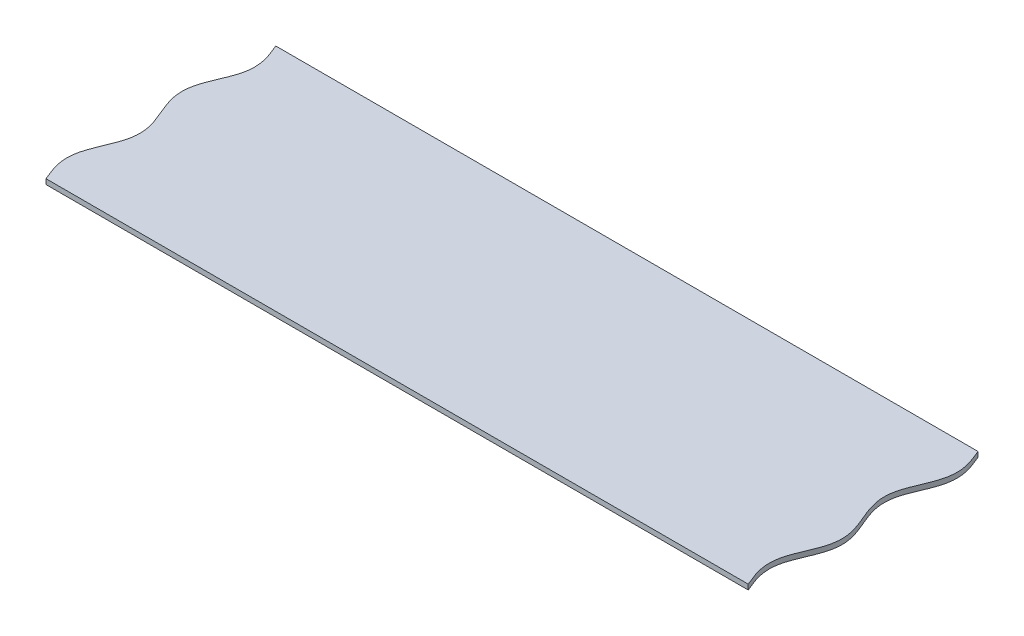
ISO-10303-21;
HEADER;
FILE_DESCRIPTION(('STEP AP214'),'2;1');
FILE_NAME('part.step','',(''),(''),'','','');
FILE_SCHEMA(('AUTOMOTIVE_DESIGN { 1 0 10303 214 1 1 1 1 }'));
ENDSEC;
DATA;
#1=APPLICATION_CONTEXT('core data for automotive mechanical design processes');
#2=APPLICATION_PROTOCOL_DEFINITION('international standard','automotive_design',2000,#1);
#3=PRODUCT_CONTEXT('',#1,'mechanical');
#4=PRODUCT('Part','Part','',(#3));
#5=PRODUCT_RELATED_PRODUCT_CATEGORY('part','',(#4));
#6=PRODUCT_DEFINITION_FORMATION('','',#4);
#7=PRODUCT_DEFINITION_CONTEXT('part definition',#1,'design');
#8=PRODUCT_DEFINITION('design','',#6,#7);
#9=PRODUCT_DEFINITION_SHAPE('','',#8);
#10=(LENGTH_UNIT() NAMED_UNIT(*) SI_UNIT(.MILLI.,.METRE.));
#11=(NAMED_UNIT(*) PLANE_ANGLE_UNIT() SI_UNIT($,.RADIAN.));
#12=(NAMED_UNIT(*) SI_UNIT($,.STERADIAN.) SOLID_ANGLE_UNIT());
#13=UNCERTAINTY_MEASURE_WITH_UNIT(LENGTH_MEASURE(1.E-05),#10,'distance_accuracy_value','');
#14=(GEOMETRIC_REPRESENTATION_CONTEXT(3) GLOBAL_UNCERTAINTY_ASSIGNED_CONTEXT((#13)) GLOBAL_UNIT_ASSIGNED_CONTEXT((#10,
#11,#12)) REPRESENTATION_CONTEXT('',''));
#15=CARTESIAN_POINT('',(0.,0.,0.));
#16=DIRECTION('',(0.,0.,1.));
#17=DIRECTION('',(1.,0.,0.));
#18=AXIS2_PLACEMENT_3D('',#15,#16,#17);
#19=CARTESIAN_POINT('',(-2.35405307341685E-08,0.4,-5.61970180202394E-08));
#20=CARTESIAN_POINT('',(0.0494495661381411,0.4,0.118048236069568));
#21=CARTESIAN_POINT('',(0.111116121184017,0.4,0.265261766996543));
#22=CARTESIAN_POINT('',(0.230875712673065,0.4,0.55805511117052));
#23=CARTESIAN_POINT('',(0.313966247908023,0.4,0.786539770390726));
#24=CARTESIAN_POINT('',(0.362563048289926,0.4,0.927516596163399));
#25=CARTESIAN_POINT('',(0.424573497522529,0.4,1.12026697634937));
#26=CARTESIAN_POINT('',(0.492346833762047,0.4,1.36157607631107));
#27=CARTESIAN_POINT('',(0.55444187721002,0.4,1.64969832437487));
#28=CARTESIAN_POINT('',(0.59227490752003,0.4,1.94940671354727));
#29=CARTESIAN_POINT('',(0.603031319326619,0.4,2.20689908536188));
#30=CARTESIAN_POINT('',(0.596617784063861,0.4,2.46474336959455));
#31=CARTESIAN_POINT('',(0.573067652303098,0.4,2.72166970040472));
#32=CARTESIAN_POINT('',(0.514178040831651,0.4,3.06399896610735));
#33=CARTESIAN_POINT('',(0.399297622639695,0.4,3.48531298984352));
#34=CARTESIAN_POINT('',(0.250895239755528,0.4,3.89566574624263));
#35=CARTESIAN_POINT('',(0.0855364014202337,0.4,4.29915457779215));
#36=CARTESIAN_POINT('',(-0.0995903555496819,0.4,4.73744639665663));
#37=CARTESIAN_POINT('',(-0.296840695920366,0.4,5.22071892240837));
#38=CARTESIAN_POINT('',(-0.493648556000378,0.4,5.79695302279281));
#39=CARTESIAN_POINT('',(-0.61897346333208,0.4,6.48344913641748));
#40=CARTESIAN_POINT('',(-0.599627971633935,0.4,7.23206646503726));
#41=CARTESIAN_POINT('',(-0.381223590951468,0.4,8.12012400416252));
#42=CARTESIAN_POINT('',(-5.5685825114775E-05,0.4,9.00003028030908));
#43=CARTESIAN_POINT('',(0.381336688080292,0.4,9.87980857089514));
#44=CARTESIAN_POINT('',(0.600500416456521,0.4,10.7676510708526));
#45=CARTESIAN_POINT('',(0.620704458219472,0.4,11.516242150026));
#46=CARTESIAN_POINT('',(0.496048404377023,0.4,12.2028761607043));
#47=CARTESIAN_POINT('',(0.299570119251832,0.4,12.7792334867136));
#48=CARTESIAN_POINT('',(0.102439221558699,0.4,13.2625534127887));
#49=CARTESIAN_POINT('',(-0.0826850468522331,0.4,13.7008510557735));
#50=CARTESIAN_POINT('',(-0.248137810946988,0.4,14.104290103407));
#51=CARTESIAN_POINT('',(-0.396725969096224,0.4,14.5145927201949));
#52=CARTESIAN_POINT('',(-0.511937811817736,0.4,14.9357809783447));
#53=CARTESIAN_POINT('',(-0.57846201816067,0.4,15.3204935820909));
#54=CARTESIAN_POINT('',(-0.604879230090261,0.4,15.6636268757174));
#55=CARTESIAN_POINT('',(-0.596327840453271,0.4,16.0079949296469));
#56=CARTESIAN_POINT('',(-0.55402238058021,0.4,16.3491642860312));
#57=CARTESIAN_POINT('',(-0.483044582191102,0.4,16.6773748268579));
#58=CARTESIAN_POINT('',(-0.392947327461695,0.4,16.9880511698901));
#59=CARTESIAN_POINT('',(-0.286122000299486,0.4,17.2934184343235));
#60=CARTESIAN_POINT('',(-0.184743293074093,0.4,17.5560837715398));
#61=CARTESIAN_POINT('',(-0.0740935836441976,0.4,17.8230984616433));
#62=CARTESIAN_POINT('',(-0.0247247362519877,0.4,17.9409758279026));
#63=CARTESIAN_POINT('',(0.,0.4,17.9999999999999));
#64=B_SPLINE_CURVE_WITH_KNOTS('',4,(#19,#20,#21,#22,#23,#24,#25,#26,#27,#28,#29,#30,#31,#32,#33,
#34,#35,#36,#37,#38,#39,#40,#41,#42,#43,#44,#45,#46,#47,#48,#49,#50,#51,#52,#53,#54,#55,#56,#57,
#58,#59,#60,#61,#62,#63),.UNSPECIFIED.,.F.,.F.,(5,1,1,1,1,1,1,1,1,1,1,1,1,1,1,1,1,1,1,1,1,1,1,1,
1,1,1,1,1,1,1,1,1,1,1,1,1,1,1,1,1,5),(0.0833223804585912,0.110604579934175,0.117425130614809,
0.124245681295442,0.131066231976076,0.13788678265671,0.153149397742294,0.168412012827879,
0.183674668985074,0.191305997063671,0.198937325142268,0.214200036492889,0.229462747843509,
0.25292917999729,0.276395612151072,0.291658349723026,0.30692108729498,0.337446562438887,
0.369116697537713,0.399642007072217,0.430167332794017,0.469468853942264,0.530519820110093,
0.569821340830344,0.600346668093855,0.63087197738376,0.662542111398898,0.69306758670517,
0.708330324358306,0.723593062011442,0.747059493053706,0.770525924095969,0.785788636660392,
0.801051349224814,0.816314004528948,0.831576659833081,0.84683927529585,0.86210189075862,
0.875742992399586,0.889384094040553,0.90302519568152,0.916666297322487),.UNSPECIFIED.);
#65=DIRECTION('',(0.,-1.,0.));
#66=VECTOR('',#65,1.);
#67=SURFACE_OF_LINEAR_EXTRUSION('',#64,#66);
#68=CARTESIAN_POINT('',(-2.35405307341685E-08,0.,-5.61970180202394E-08));
#69=CARTESIAN_POINT('',(0.0494495661381411,0.,0.118048236069568));
#70=CARTESIAN_POINT('',(0.111116121184017,0.,0.265261766996543));
#71=CARTESIAN_POINT('',(0.230875712673065,0.,0.55805511117052));
#72=CARTESIAN_POINT('',(0.313966247908023,0.,0.786539770390726));
#73=CARTESIAN_POINT('',(0.362563048289926,0.,0.927516596163399));
#74=CARTESIAN_POINT('',(0.424573497522529,0.,1.12026697634937));
#75=CARTESIAN_POINT('',(0.492346833762047,0.,1.36157607631107));
#76=CARTESIAN_POINT('',(0.55444187721002,0.,1.64969832437487));
#77=CARTESIAN_POINT('',(0.59227490752003,0.,1.94940671354727));
#78=CARTESIAN_POINT('',(0.603031319326619,0.,2.20689908536188));
#79=CARTESIAN_POINT('',(0.596617784063861,0.,2.46474336959455));
#80=CARTESIAN_POINT('',(0.573067652303098,0.,2.72166970040472));
#81=CARTESIAN_POINT('',(0.514178040831651,0.,3.06399896610735));
#82=CARTESIAN_POINT('',(0.399297622639695,0.,3.48531298984352));
#83=CARTESIAN_POINT('',(0.250895239755528,0.,3.89566574624263));
#84=CARTESIAN_POINT('',(0.0855364014202337,0.,4.29915457779215));
#85=CARTESIAN_POINT('',(-0.0995903555496819,0.,4.73744639665663));
#86=CARTESIAN_POINT('',(-0.296840695920366,0.,5.22071892240837));
#87=CARTESIAN_POINT('',(-0.493648556000378,0.,5.79695302279281));
#88=CARTESIAN_POINT('',(-0.61897346333208,0.,6.48344913641748));
#89=CARTESIAN_POINT('',(-0.599627971633935,0.,7.23206646503726));
#90=CARTESIAN_POINT('',(-0.381223590951468,0.,8.12012400416252));
#91=CARTESIAN_POINT('',(-5.5685825114775E-05,0.,9.00003028030908));
#92=CARTESIAN_POINT('',(0.381336688080292,0.,9.87980857089514));
#93=CARTESIAN_POINT('',(0.600500416456521,0.,10.7676510708526));
#94=CARTESIAN_POINT('',(0.620704458219472,0.,11.516242150026));
#95=CARTESIAN_POINT('',(0.496048404377023,0.,12.2028761607043));
#96=CARTESIAN_POINT('',(0.299570119251832,0.,12.7792334867136));
#97=CARTESIAN_POINT('',(0.102439221558699,0.,13.2625534127887));
#98=CARTESIAN_POINT('',(-0.0826850468522331,0.,13.7008510557735));
#99=CARTESIAN_POINT('',(-0.248137810946988,0.,14.104290103407));
#100=CARTESIAN_POINT('',(-0.396725969096224,0.,14.5145927201949));
#101=CARTESIAN_POINT('',(-0.511937811817736,0.,14.9357809783447));
#102=CARTESIAN_POINT('',(-0.57846201816067,0.,15.3204935820909));
#103=CARTESIAN_POINT('',(-0.604879230090261,0.,15.6636268757174));
#104=CARTESIAN_POINT('',(-0.596327840453271,0.,16.0079949296469));
#105=CARTESIAN_POINT('',(-0.55402238058021,0.,16.3491642860312));
#106=CARTESIAN_POINT('',(-0.483044582191102,0.,16.6773748268579));
#107=CARTESIAN_POINT('',(-0.392947327461695,0.,16.9880511698901));
#108=CARTESIAN_POINT('',(-0.286122000299486,0.,17.2934184343235));
#109=CARTESIAN_POINT('',(-0.184743293074093,0.,17.5560837715398));
#110=CARTESIAN_POINT('',(-0.0740935836441976,0.,17.8230984616433));
#111=CARTESIAN_POINT('',(-0.0247247362519877,0.,17.9409758279026));
#112=CARTESIAN_POINT('',(0.,0.,17.9999999999999));
#113=B_SPLINE_CURVE_WITH_KNOTS('',4,(#68,#69,#70,#71,#72,#73,#74,#75,#76,#77,#78,#79,#80,#81,
#82,#83,#84,#85,#86,#87,#88,#89,#90,#91,#92,#93,#94,#95,#96,#97,#98,#99,#100,#101,#102,#103,
#104,#105,#106,#107,#108,#109,#110,#111,#112),.UNSPECIFIED.,.F.,.F.,(5,1,1,1,1,1,1,1,1,1,1,1,1,
1,1,1,1,1,1,1,1,1,1,1,1,1,1,1,1,1,1,1,1,1,1,1,1,1,1,1,1,5),(0.0833223804585912,
0.110604579934175,0.117425130614809,0.124245681295442,0.131066231976076,0.13788678265671,
0.153149397742294,0.168412012827879,0.183674668985074,0.191305997063671,0.198937325142268,
0.214200036492889,0.229462747843509,0.25292917999729,0.276395612151072,0.291658349723026,
0.30692108729498,0.337446562438887,0.369116697537713,0.399642007072217,0.430167332794017,
0.469468853942264,0.530519820110093,0.569821340830344,0.600346668093855,0.63087197738376,
0.662542111398898,0.69306758670517,0.708330324358306,0.723593062011442,0.747059493053706,
0.770525924095969,0.785788636660392,0.801051349224814,0.816314004528948,0.831576659833081,
0.84683927529585,0.86210189075862,0.875742992399586,0.889384094040553,0.90302519568152,
0.916666297322487),.UNSPECIFIED.);
#114=CARTESIAN_POINT('',(0.,0.,0.));
#115=VERTEX_POINT('',#114);
#116=CARTESIAN_POINT('',(0.,0.,18.));
#117=VERTEX_POINT('',#116);
#118=EDGE_CURVE('E122',#115,#117,#113,.T.);
#119=ORIENTED_EDGE('',*,*,#118,.T.);
#120=DIRECTION('',(0.,-1.,0.));
#121=VECTOR('',#120,1.);
#122=CARTESIAN_POINT('',(0.,0.4,18.));
#123=LINE('',#122,#121);
#124=CARTESIAN_POINT('',(0.,0.4,18.));
#125=VERTEX_POINT('',#124);
#126=EDGE_CURVE('E11',#125,#117,#123,.T.);
#127=ORIENTED_EDGE('',*,*,#126,.F.);
#128=CARTESIAN_POINT('',(0.,0.4,0.));
#129=VERTEX_POINT('',#128);
#130=EDGE_CURVE('E91',#129,#125,#64,.T.);
#131=ORIENTED_EDGE('',*,*,#130,.F.);
#132=DIRECTION('',(0.,-1.,0.));
#133=VECTOR('',#132,1.);
#134=CARTESIAN_POINT('',(0.,0.4,0.));
#135=LINE('',#134,#133);
#136=EDGE_CURVE('E99',#129,#115,#135,.T.);
#137=ORIENTED_EDGE('',*,*,#136,.T.);
#138=EDGE_LOOP('',(#119,#127,#131,#137));
#139=FACE_BOUND('',#138,.T.);
#140=ADVANCED_FACE('F39',(#139),#67,.F.);
#141=CARTESIAN_POINT('',(55.,0.4,18.));
#142=DIRECTION('',(0.,0.,-1.));
#143=DIRECTION('',(-1.,0.,0.));
#144=AXIS2_PLACEMENT_3D('',#141,#142,#143);
#145=PLANE('',#144);
#146=DIRECTION('',(1.,0.,0.));
#147=VECTOR('',#146,1.);
#148=CARTESIAN_POINT('',(55.,0.,18.));
#149=LINE('',#148,#147);
#150=CARTESIAN_POINT('',(55.,0.,17.9999999999999));
#151=VERTEX_POINT('',#150);
#152=EDGE_CURVE('E95',#117,#151,#149,.T.);
#153=ORIENTED_EDGE('',*,*,#152,.T.);
#154=DIRECTION('',(0.,-1.,0.));
#155=VECTOR('',#154,1.);
#156=CARTESIAN_POINT('',(55.,0.4,17.9999999999999));
#157=LINE('',#156,#155);
#158=CARTESIAN_POINT('',(55.,0.4,17.9999999999999));
#159=VERTEX_POINT('',#158);
#160=EDGE_CURVE('E48',#159,#151,#157,.T.);
#161=ORIENTED_EDGE('',*,*,#160,.F.);
#162=DIRECTION('',(1.,0.,0.));
#163=VECTOR('',#162,1.);
#164=CARTESIAN_POINT('',(55.,0.4,18.));
#165=LINE('',#164,#163);
#166=EDGE_CURVE('E86',#125,#159,#165,.T.);
#167=ORIENTED_EDGE('',*,*,#166,.F.);
#168=ORIENTED_EDGE('',*,*,#126,.T.);
#169=EDGE_LOOP('',(#153,#161,#167,#168));
#170=FACE_BOUND('',#169,.T.);
#171=ADVANCED_FACE('F94',(#170),#145,.F.);
#172=CARTESIAN_POINT('',(55.,0.4,17.9999999999999));
#173=CARTESIAN_POINT('',(54.975275263748,0.4,17.9409758279025));
#174=CARTESIAN_POINT('',(54.9259064163558,0.4,17.8230984616432));
#175=CARTESIAN_POINT('',(54.8152567069258,0.4,17.5560837715396));
#176=CARTESIAN_POINT('',(54.7138779997004,0.4,17.2934184343232));
#177=CARTESIAN_POINT('',(54.6070526725382,0.4,16.9880511698898));
#178=CARTESIAN_POINT('',(54.5169554178088,0.4,16.6773748268576));
#179=CARTESIAN_POINT('',(54.4459776194196,0.4,16.3491642860308));
#180=CARTESIAN_POINT('',(54.4036721595466,0.4,16.0079949296466));
#181=CARTESIAN_POINT('',(54.3951207699096,0.4,15.6636268757171));
#182=CARTESIAN_POINT('',(54.4215379818392,0.4,15.3204935820906));
#183=CARTESIAN_POINT('',(54.4880621881821,0.4,14.9357809783444));
#184=CARTESIAN_POINT('',(54.6032740309036,0.4,14.5145927201945));
#185=CARTESIAN_POINT('',(54.7518621890529,0.4,14.1042901034067));
#186=CARTESIAN_POINT('',(54.9173149531476,0.4,13.7008510557731));
#187=CARTESIAN_POINT('',(55.1024392215585,0.4,13.2625534127883));
#188=CARTESIAN_POINT('',(55.2995701192517,0.4,12.7792334867133));
#189=CARTESIAN_POINT('',(55.4960484043769,0.4,12.202876160704));
#190=CARTESIAN_POINT('',(55.6207044582193,0.4,11.5162421500257));
#191=CARTESIAN_POINT('',(55.6005004164564,0.4,10.7676510708523));
#192=CARTESIAN_POINT('',(55.3813366880802,0.4,9.87980857089479));
#193=CARTESIAN_POINT('',(54.9999443141747,0.4,9.00003028030873));
#194=CARTESIAN_POINT('',(54.6187764090484,0.4,8.12012400416217));
#195=CARTESIAN_POINT('',(54.4003720283659,0.4,7.23206646503692));
#196=CARTESIAN_POINT('',(54.3810265366678,0.4,6.48344913641714));
#197=CARTESIAN_POINT('',(54.5063514439995,0.4,5.79695302279247));
#198=CARTESIAN_POINT('',(54.7031593040795,0.4,5.22071892240803));
#199=CARTESIAN_POINT('',(54.9004096444502,0.4,4.73744639665629));
#200=CARTESIAN_POINT('',(55.0855364014201,0.4,4.29915457779181));
#201=CARTESIAN_POINT('',(55.2508952397554,0.4,3.89566574624229));
#202=CARTESIAN_POINT('',(55.3992976226396,0.4,3.48531298984318));
#203=CARTESIAN_POINT('',(55.5141780408315,0.4,3.06399896610701));
#204=CARTESIAN_POINT('',(55.573067652303,0.4,2.72166970040438));
#205=CARTESIAN_POINT('',(55.5966177840637,0.4,2.4647433695942));
#206=CARTESIAN_POINT('',(55.6030313193265,0.4,2.20689908536154));
#207=CARTESIAN_POINT('',(55.5922749075199,0.4,1.94940671354693));
#208=CARTESIAN_POINT('',(55.5544418772099,0.4,1.64969832437453));
#209=CARTESIAN_POINT('',(55.4923468337619,0.4,1.36157607631072));
#210=CARTESIAN_POINT('',(55.4245734975224,0.4,1.12026697634903));
#211=CARTESIAN_POINT('',(55.3625630482898,0.4,0.927516596163056));
#212=CARTESIAN_POINT('',(55.3139662479079,0.4,0.786539770390383));
#213=CARTESIAN_POINT('',(55.2308757126729,0.4,0.558055111170177));
#214=CARTESIAN_POINT('',(55.1111161211839,0.4,0.2652617669962));
#215=CARTESIAN_POINT('',(55.049449566138,0.4,0.118048236069224));
#216=CARTESIAN_POINT('',(54.9999999764593,0.4,-5.61973613531861E-08));
#217=B_SPLINE_CURVE_WITH_KNOTS('',4,(#172,#173,#174,#175,#176,#177,#178,#179,#180,#181,#182,
#183,#184,#185,#186,#187,#188,#189,#190,#191,#192,#193,#194,#195,#196,#197,#198,#199,#200,#201,
#202,#203,#204,#205,#206,#207,#208,#209,#210,#211,#212,#213,#214,#215,#216),.UNSPECIFIED.,.F.,
.F.,(5,1,1,1,1,1,1,1,1,1,1,1,1,1,1,1,1,1,1,1,1,1,1,1,1,1,1,1,1,1,1,1,1,1,1,1,1,1,1,1,1,5),
(0.0833223804586111,0.096963482099578,0.110604583740545,0.124245685381512,0.137886787022479,
0.153149402485248,0.168412017948017,0.183674673252151,0.198937328556284,0.214200041120706,
0.229462753685129,0.252929184727393,0.276395615769656,0.291658353422792,0.306921091075928,
0.3374465663822,0.369116700397338,0.399642009687243,0.430167336950754,0.469468857671005,
0.530519823838834,0.569821344987081,0.600346670708881,0.630871980243385,0.662542115342211,
0.693067590486119,0.708330328058072,0.723593065630026,0.747059497783808,0.770525929937589,
0.78578864128821,0.80105135263883,0.808682680717427,0.816314008796025,0.831576664953219,
0.846839280038804,0.862101895124388,0.868922445805022,0.875742996485656,0.88256354716629,
0.889384097846923,0.916666297322487),.UNSPECIFIED.);
#218=DIRECTION('',(0.,-1.,0.));
#219=VECTOR('',#218,1.);
#220=SURFACE_OF_LINEAR_EXTRUSION('',#217,#219);
#221=CARTESIAN_POINT('',(55.,0.,17.9999999999999));
#222=CARTESIAN_POINT('',(54.975275263748,0.,17.9409758279025));
#223=CARTESIAN_POINT('',(54.9259064163558,0.,17.8230984616432));
#224=CARTESIAN_POINT('',(54.8152567069258,0.,17.5560837715396));
#225=CARTESIAN_POINT('',(54.7138779997004,0.,17.2934184343232));
#226=CARTESIAN_POINT('',(54.6070526725382,0.,16.9880511698898));
#227=CARTESIAN_POINT('',(54.5169554178088,0.,16.6773748268576));
#228=CARTESIAN_POINT('',(54.4459776194196,0.,16.3491642860308));
#229=CARTESIAN_POINT('',(54.4036721595466,0.,16.0079949296466));
#230=CARTESIAN_POINT('',(54.3951207699096,0.,15.6636268757171));
#231=CARTESIAN_POINT('',(54.4215379818392,0.,15.3204935820906));
#232=CARTESIAN_POINT('',(54.4880621881821,0.,14.9357809783444));
#233=CARTESIAN_POINT('',(54.6032740309036,0.,14.5145927201945));
#234=CARTESIAN_POINT('',(54.7518621890529,0.,14.1042901034067));
#235=CARTESIAN_POINT('',(54.9173149531476,0.,13.7008510557731));
#236=CARTESIAN_POINT('',(55.1024392215585,0.,13.2625534127883));
#237=CARTESIAN_POINT('',(55.2995701192517,0.,12.7792334867133));
#238=CARTESIAN_POINT('',(55.4960484043769,0.,12.202876160704));
#239=CARTESIAN_POINT('',(55.6207044582193,0.,11.5162421500257));
#240=CARTESIAN_POINT('',(55.6005004164564,0.,10.7676510708523));
#241=CARTESIAN_POINT('',(55.3813366880802,0.,9.87980857089479));
#242=CARTESIAN_POINT('',(54.9999443141747,0.,9.00003028030873));
#243=CARTESIAN_POINT('',(54.6187764090484,0.,8.12012400416217));
#244=CARTESIAN_POINT('',(54.4003720283659,0.,7.23206646503692));
#245=CARTESIAN_POINT('',(54.3810265366678,0.,6.48344913641714));
#246=CARTESIAN_POINT('',(54.5063514439995,0.,5.79695302279247));
#247=CARTESIAN_POINT('',(54.7031593040795,0.,5.22071892240803));
#248=CARTESIAN_POINT('',(54.9004096444502,0.,4.73744639665629));
#249=CARTESIAN_POINT('',(55.0855364014201,0.,4.29915457779181));
#250=CARTESIAN_POINT('',(55.2508952397554,0.,3.89566574624229));
#251=CARTESIAN_POINT('',(55.3992976226396,0.,3.48531298984318));
#252=CARTESIAN_POINT('',(55.5141780408315,0.,3.06399896610701));
#253=CARTESIAN_POINT('',(55.573067652303,0.,2.72166970040438));
#254=CARTESIAN_POINT('',(55.5966177840637,0.,2.4647433695942));
#255=CARTESIAN_POINT('',(55.6030313193265,0.,2.20689908536154));
#256=CARTESIAN_POINT('',(55.5922749075199,0.,1.94940671354693));
#257=CARTESIAN_POINT('',(55.5544418772099,0.,1.64969832437453));
#258=CARTESIAN_POINT('',(55.4923468337619,0.,1.36157607631072));
#259=CARTESIAN_POINT('',(55.4245734975224,0.,1.12026697634903));
#260=CARTESIAN_POINT('',(55.3625630482898,0.,0.927516596163056));
#261=CARTESIAN_POINT('',(55.3139662479079,0.,0.786539770390383));
#262=CARTESIAN_POINT('',(55.2308757126729,0.,0.558055111170177));
#263=CARTESIAN_POINT('',(55.1111161211839,0.,0.2652617669962));
#264=CARTESIAN_POINT('',(55.049449566138,0.,0.118048236069224));
#265=CARTESIAN_POINT('',(54.9999999764593,0.,-5.61973613531861E-08));
#266=B_SPLINE_CURVE_WITH_KNOTS('',4,(#221,#222,#223,#224,#225,#226,#227,#228,#229,#230,#231,
#232,#233,#234,#235,#236,#237,#238,#239,#240,#241,#242,#243,#244,#245,#246,#247,#248,#249,#250,
#251,#252,#253,#254,#255,#256,#257,#258,#259,#260,#261,#262,#263,#264,#265),.UNSPECIFIED.,.F.,
.F.,(5,1,1,1,1,1,1,1,1,1,1,1,1,1,1,1,1,1,1,1,1,1,1,1,1,1,1,1,1,1,1,1,1,1,1,1,1,1,1,1,1,5),
(0.0833223804586111,0.096963482099578,0.110604583740545,0.124245685381512,0.137886787022479,
0.153149402485248,0.168412017948017,0.183674673252151,0.198937328556284,0.214200041120706,
0.229462753685129,0.252929184727393,0.276395615769656,0.291658353422792,0.306921091075928,
0.3374465663822,0.369116700397338,0.399642009687243,0.430167336950754,0.469468857671005,
0.530519823838834,0.569821344987081,0.600346670708881,0.630871980243385,0.662542115342211,
0.693067590486119,0.708330328058072,0.723593065630026,0.747059497783808,0.770525929937589,
0.78578864128821,0.80105135263883,0.808682680717427,0.816314008796025,0.831576664953219,
0.846839280038804,0.862101895124388,0.868922445805022,0.875742996485656,0.88256354716629,
0.889384097846923,0.916666297322487),.UNSPECIFIED.);
#267=CARTESIAN_POINT('',(55.,0.,0.));
#268=VERTEX_POINT('',#267);
#269=EDGE_CURVE('E73',#151,#268,#266,.T.);
#270=ORIENTED_EDGE('',*,*,#269,.T.);
#271=DIRECTION('',(0.,-1.,0.));
#272=VECTOR('',#271,1.);
#273=CARTESIAN_POINT('',(55.,0.4,0.));
#274=LINE('',#273,#272);
#275=CARTESIAN_POINT('',(55.,0.4,0.));
#276=VERTEX_POINT('',#275);
#277=EDGE_CURVE('E96',#276,#268,#274,.T.);
#278=ORIENTED_EDGE('',*,*,#277,.F.);
#279=EDGE_CURVE('E89',#159,#276,#217,.T.);
#280=ORIENTED_EDGE('',*,*,#279,.F.);
#281=ORIENTED_EDGE('',*,*,#160,.T.);
#282=EDGE_LOOP('',(#270,#278,#280,#281));
#283=FACE_BOUND('',#282,.T.);
#284=ADVANCED_FACE('F97',(#283),#220,.F.);
#285=CARTESIAN_POINT('',(0.,0.4,0.));
#286=DIRECTION('',(0.,0.,1.));
#287=DIRECTION('',(1.,0.,0.));
#288=AXIS2_PLACEMENT_3D('',#285,#286,#287);
#289=PLANE('',#288);
#290=DIRECTION('',(-1.,0.,0.));
#291=VECTOR('',#290,1.);
#292=CARTESIAN_POINT('',(0.,0.,0.));
#293=LINE('',#292,#291);
#294=EDGE_CURVE('E79',#268,#115,#293,.T.);
#295=ORIENTED_EDGE('',*,*,#294,.T.);
#296=ORIENTED_EDGE('',*,*,#136,.F.);
#297=DIRECTION('',(-1.,0.,0.));
#298=VECTOR('',#297,1.);
#299=CARTESIAN_POINT('',(0.,0.4,0.));
#300=LINE('',#299,#298);
#301=EDGE_CURVE('E56',#276,#129,#300,.T.);
#302=ORIENTED_EDGE('',*,*,#301,.F.);
#303=ORIENTED_EDGE('',*,*,#277,.T.);
#304=EDGE_LOOP('',(#295,#296,#302,#303));
#305=FACE_BOUND('',#304,.T.);
#306=ADVANCED_FACE('F111',(#305),#289,.F.);
#307=CARTESIAN_POINT('',(1.71800435565304E-07,0.4,8.9999999423807));
#308=DIRECTION('',(0.,1.,0.));
#309=DIRECTION('',(0.,0.,1.));
#310=AXIS2_PLACEMENT_3D('',#307,#308,#309);
#311=PLANE('',#310);
#312=ORIENTED_EDGE('',*,*,#130,.T.);
#313=ORIENTED_EDGE('',*,*,#166,.T.);
#314=ORIENTED_EDGE('',*,*,#279,.T.);
#315=ORIENTED_EDGE('',*,*,#301,.T.);
#316=EDGE_LOOP('',(#312,#313,#314,#315));
#317=FACE_BOUND('',#316,.T.);
#318=ADVANCED_FACE('F87',(#317),#311,.T.);
#319=CARTESIAN_POINT('',(1.71800435565304E-07,0.,8.9999999423807));
#320=DIRECTION('',(0.,1.,0.));
#321=DIRECTION('',(0.,0.,1.));
#322=AXIS2_PLACEMENT_3D('',#319,#320,#321);
#323=PLANE('',#322);
#324=ORIENTED_EDGE('',*,*,#118,.F.);
#325=ORIENTED_EDGE('',*,*,#294,.F.);
#326=ORIENTED_EDGE('',*,*,#269,.F.);
#327=ORIENTED_EDGE('',*,*,#152,.F.);
#328=EDGE_LOOP('',(#324,#325,#326,#327));
#329=FACE_BOUND('',#328,.T.);
#330=ADVANCED_FACE('F139',(#329),#323,.F.);
#331=CLOSED_SHELL('',(#140,#171,#284,#306,#318,#330));
#332=MANIFOLD_SOLID_BREP('B2',#331);
#333=ADVANCED_BREP_SHAPE_REPRESENTATION('',(#18,#332),#14);
#334=SHAPE_DEFINITION_REPRESENTATION(#9,#333);
ENDSEC;
END-ISO-10303-21;
